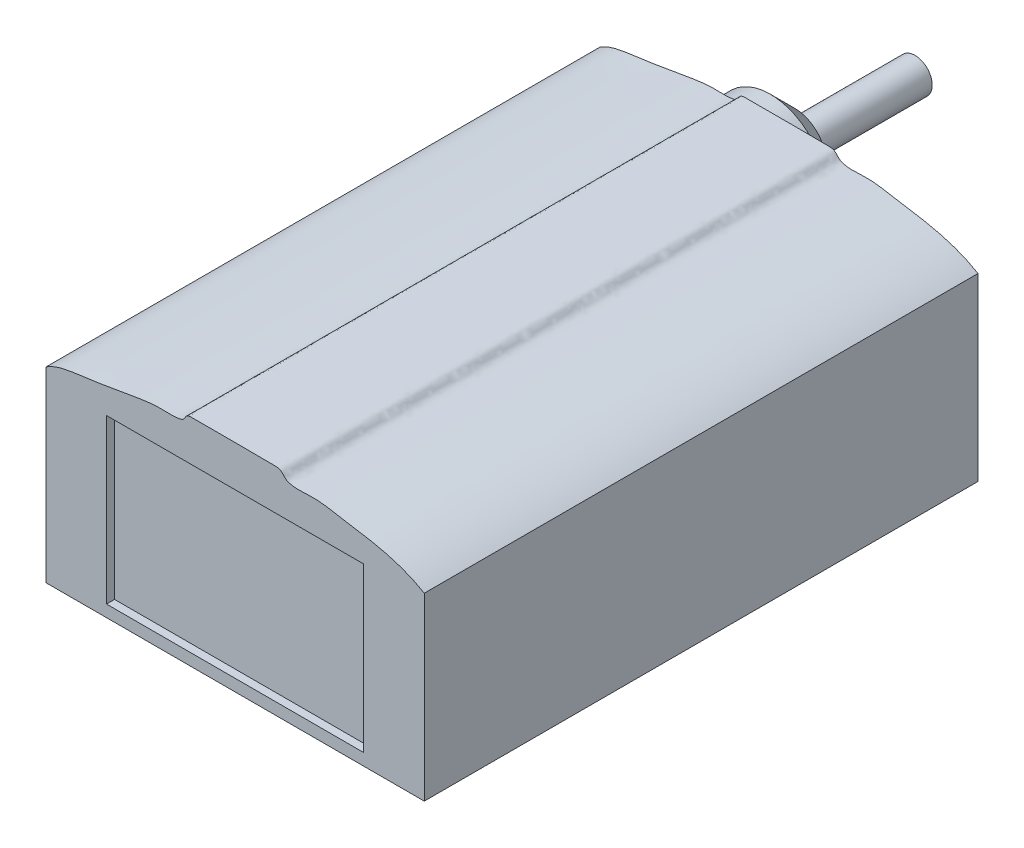
ISO-10303-21;
HEADER;
FILE_DESCRIPTION(('STEP AP214'),'2;1');
FILE_NAME('part.step','',(''),(''),'','','');
FILE_SCHEMA(('AUTOMOTIVE_DESIGN { 1 0 10303 214 1 1 1 1 }'));
ENDSEC;
DATA;
#1=APPLICATION_CONTEXT('core data for automotive mechanical design processes');
#2=APPLICATION_PROTOCOL_DEFINITION('international standard','automotive_design',2000,#1);
#3=PRODUCT_CONTEXT('',#1,'mechanical');
#4=PRODUCT('Part','Part','',(#3));
#5=PRODUCT_RELATED_PRODUCT_CATEGORY('part','',(#4));
#6=PRODUCT_DEFINITION_FORMATION('','',#4);
#7=PRODUCT_DEFINITION_CONTEXT('part definition',#1,'design');
#8=PRODUCT_DEFINITION('design','',#6,#7);
#9=PRODUCT_DEFINITION_SHAPE('','',#8);
#10=(LENGTH_UNIT() NAMED_UNIT(*) SI_UNIT(.MILLI.,.METRE.));
#11=(NAMED_UNIT(*) PLANE_ANGLE_UNIT() SI_UNIT($,.RADIAN.));
#12=(NAMED_UNIT(*) SI_UNIT($,.STERADIAN.) SOLID_ANGLE_UNIT());
#13=UNCERTAINTY_MEASURE_WITH_UNIT(LENGTH_MEASURE(1.E-05),#10,'distance_accuracy_value','');
#14=(GEOMETRIC_REPRESENTATION_CONTEXT(3) GLOBAL_UNCERTAINTY_ASSIGNED_CONTEXT((#13)) GLOBAL_UNIT_ASSIGNED_CONTEXT((#10,
#11,#12)) REPRESENTATION_CONTEXT('',''));
#15=CARTESIAN_POINT('',(0.,0.,0.));
#16=DIRECTION('',(0.,0.,1.));
#17=DIRECTION('',(1.,0.,0.));
#18=AXIS2_PLACEMENT_3D('',#15,#16,#17);
#19=CARTESIAN_POINT('',(-140.98194211339,-84.1096780381696,68.9));
#20=DIRECTION('',(-1.,0.,0.));
#21=DIRECTION('',(0.,0.,1.));
#22=AXIS2_PLACEMENT_3D('',#19,#20,#21);
#23=PLANE('',#22);
#24=DIRECTION('',(0.,1.,0.));
#25=VECTOR('',#24,1.);
#26=CARTESIAN_POINT('',(-140.98194211339,-84.1096780381696,0.));
#27=LINE('',#26,#25);
#28=CARTESIAN_POINT('',(-140.98194211339,-106.521233953106,0.));
#29=VERTEX_POINT('',#28);
#30=CARTESIAN_POINT('',(-140.98194211339,-84.1096780381696,0.));
#31=VERTEX_POINT('',#30);
#32=EDGE_CURVE('E148',#29,#31,#27,.T.);
#33=ORIENTED_EDGE('',*,*,#32,.T.);
#34=DIRECTION('',(0.,0.,-1.));
#35=VECTOR('',#34,1.);
#36=CARTESIAN_POINT('',(-140.98194211339,-84.1096780381696,68.9));
#37=LINE('',#36,#35);
#38=CARTESIAN_POINT('',(-140.98194211339,-84.1096780381696,68.9));
#39=VERTEX_POINT('',#38);
#40=EDGE_CURVE('E175',#39,#31,#37,.T.);
#41=ORIENTED_EDGE('',*,*,#40,.F.);
#42=DIRECTION('',(0.,1.,0.));
#43=VECTOR('',#42,1.);
#44=CARTESIAN_POINT('',(-140.98194211339,-84.1096780381696,68.9));
#45=LINE('',#44,#43);
#46=CARTESIAN_POINT('',(-140.98194211339,-106.521233953106,68.9));
#47=VERTEX_POINT('',#46);
#48=EDGE_CURVE('E150',#47,#39,#45,.T.);
#49=ORIENTED_EDGE('',*,*,#48,.F.);
#50=DIRECTION('',(0.,0.,-1.));
#51=VECTOR('',#50,1.);
#52=CARTESIAN_POINT('',(-140.98194211339,-106.521233953106,68.9));
#53=LINE('',#52,#51);
#54=EDGE_CURVE('E176',#47,#29,#53,.T.);
#55=ORIENTED_EDGE('',*,*,#54,.T.);
#56=EDGE_LOOP('',(#33,#41,#49,#55));
#57=FACE_BOUND('',#56,.T.);
#58=ADVANCED_FACE('F32',(#57),#23,.F.);
#59=CARTESIAN_POINT('',(-140.98194211339,-84.1096780381696,68.9));
#60=CARTESIAN_POINT('',(-142.926815311891,-82.9516409905917,68.9));
#61=CARTESIAN_POINT('',(-146.373565536085,-81.8972950871516,68.9));
#62=CARTESIAN_POINT('',(-151.070724865634,-81.2670738500775,68.9));
#63=CARTESIAN_POINT('',(-154.650535556346,-80.5007113797014,68.9));
#64=CARTESIAN_POINT('',(-156.859894773962,-80.9524390764179,68.9));
#65=CARTESIAN_POINT('',(-158.338667639974,-80.4501070385358,68.9));
#66=CARTESIAN_POINT('',(-158.75592069697,-79.6610562019092,68.9));
#67=CARTESIAN_POINT('',(-161.911227506149,-79.6747307356788,68.9));
#68=CARTESIAN_POINT('',(-168.676391513711,-79.5974541144209,68.9));
#69=CARTESIAN_POINT('',(-170.710950221123,-79.6679789403554,68.9));
#70=CARTESIAN_POINT('',(-170.781028922424,-80.4021499559249,68.9));
#71=CARTESIAN_POINT('',(-172.311248734605,-80.7264156411539,68.9));
#72=CARTESIAN_POINT('',(-174.129855051625,-80.4879074300966,68.9));
#73=CARTESIAN_POINT('',(-177.11443979036,-80.9668373289222,68.9));
#74=CARTESIAN_POINT('',(-180.269750477612,-81.5393009612148,68.9));
#75=CARTESIAN_POINT('',(-184.014745848683,-82.0981839605226,68.9));
#76=CARTESIAN_POINT('',(-186.751441624602,-82.4001034778678,68.9));
#77=CARTESIAN_POINT('',(-188.05194211339,-83.2641710067041,68.9));
#78=B_SPLINE_CURVE_WITH_KNOTS('',3,(#59,#60,#61,#62,#63,#64,#65,#66,#67,#68,#69,#70,#71,#72,#73,
#74,#75,#76,#77),.UNSPECIFIED.,.F.,.F.,(4,1,1,1,1,1,1,1,1,1,1,1,1,1,1,1,4),(0.,
0.125193101078985,0.195471816087271,0.265347399385533,0.320434923868102,0.328753754329254,
0.346337709589521,0.360830221550765,0.459186361980452,0.475147960494931,0.504484608181078,
0.516555423799239,0.592189035715779,0.674550960962052,0.768343750931255,0.869311161488554,1.),.UNSPECIFIED.);
#79=DIRECTION('',(0.,0.,-1.));
#80=VECTOR('',#79,1.);
#81=SURFACE_OF_LINEAR_EXTRUSION('',#78,#80);
#82=CARTESIAN_POINT('',(-140.98194211339,-84.1096780381696,0.));
#83=CARTESIAN_POINT('',(-142.926815311891,-82.9516409905917,0.));
#84=CARTESIAN_POINT('',(-146.373565536085,-81.8972950871516,0.));
#85=CARTESIAN_POINT('',(-151.070724865634,-81.2670738500775,0.));
#86=CARTESIAN_POINT('',(-154.650535556346,-80.5007113797014,0.));
#87=CARTESIAN_POINT('',(-156.859894773962,-80.9524390764179,0.));
#88=CARTESIAN_POINT('',(-158.338667639974,-80.4501070385358,0.));
#89=CARTESIAN_POINT('',(-158.75592069697,-79.6610562019092,0.));
#90=CARTESIAN_POINT('',(-161.911227506149,-79.6747307356788,0.));
#91=CARTESIAN_POINT('',(-168.676391513711,-79.5974541144209,0.));
#92=CARTESIAN_POINT('',(-170.710950221123,-79.6679789403554,0.));
#93=CARTESIAN_POINT('',(-170.781028922424,-80.4021499559249,0.));
#94=CARTESIAN_POINT('',(-172.311248734605,-80.7264156411539,0.));
#95=CARTESIAN_POINT('',(-174.129855051625,-80.4879074300966,0.));
#96=CARTESIAN_POINT('',(-177.11443979036,-80.9668373289222,0.));
#97=CARTESIAN_POINT('',(-180.269750477612,-81.5393009612148,0.));
#98=CARTESIAN_POINT('',(-184.014745848683,-82.0981839605226,0.));
#99=CARTESIAN_POINT('',(-186.751441624602,-82.4001034778678,0.));
#100=CARTESIAN_POINT('',(-188.05194211339,-83.2641710067041,0.));
#101=B_SPLINE_CURVE_WITH_KNOTS('',3,(#82,#83,#84,#85,#86,#87,#88,#89,#90,#91,#92,#93,#94,#95,
#96,#97,#98,#99,#100),.UNSPECIFIED.,.F.,.F.,(4,1,1,1,1,1,1,1,1,1,1,1,1,1,1,1,4),(0.,
0.125193101078985,0.195471816087271,0.265347399385533,0.320434923868102,0.328753754329254,
0.346337709589521,0.360830221550765,0.459186361980452,0.475147960494931,0.504484608181078,
0.516555423799239,0.592189035715779,0.674550960962052,0.768343750931255,0.869311161488554,1.),.UNSPECIFIED.);
#102=CARTESIAN_POINT('',(-188.05194211339,-83.2641710067041,0.));
#103=VERTEX_POINT('',#102);
#104=EDGE_CURVE('E178',#31,#103,#101,.T.);
#105=ORIENTED_EDGE('',*,*,#104,.T.);
#106=DIRECTION('',(0.,0.,-1.));
#107=VECTOR('',#106,1.);
#108=CARTESIAN_POINT('',(-188.05194211339,-83.2641710067041,68.9));
#109=LINE('',#108,#107);
#110=CARTESIAN_POINT('',(-188.05194211339,-83.2641710067041,68.9));
#111=VERTEX_POINT('',#110);
#112=EDGE_CURVE('E193',#111,#103,#109,.T.);
#113=ORIENTED_EDGE('',*,*,#112,.F.);
#114=EDGE_CURVE('E86',#39,#111,#78,.T.);
#115=ORIENTED_EDGE('',*,*,#114,.F.);
#116=ORIENTED_EDGE('',*,*,#40,.T.);
#117=EDGE_LOOP('',(#105,#113,#115,#116));
#118=FACE_BOUND('',#117,.T.);
#119=ADVANCED_FACE('F162',(#118),#81,.F.);
#120=CARTESIAN_POINT('',(-188.05194211339,-83.2641710067041,68.9));
#121=DIRECTION('',(1.,0.,0.));
#122=DIRECTION('',(0.,0.,-1.));
#123=AXIS2_PLACEMENT_3D('',#120,#121,#122);
#124=PLANE('',#123);
#125=DIRECTION('',(0.,-1.,0.));
#126=VECTOR('',#125,1.);
#127=CARTESIAN_POINT('',(-188.05194211339,-83.2641710067041,0.));
#128=LINE('',#127,#126);
#129=CARTESIAN_POINT('',(-188.05194211339,-106.521233953106,0.));
#130=VERTEX_POINT('',#129);
#131=EDGE_CURVE('E180',#103,#130,#128,.T.);
#132=ORIENTED_EDGE('',*,*,#131,.T.);
#133=DIRECTION('',(0.,0.,-1.));
#134=VECTOR('',#133,1.);
#135=CARTESIAN_POINT('',(-188.05194211339,-106.521233953106,68.9));
#136=LINE('',#135,#134);
#137=CARTESIAN_POINT('',(-188.05194211339,-106.521233953106,68.9));
#138=VERTEX_POINT('',#137);
#139=EDGE_CURVE('E191',#138,#130,#136,.T.);
#140=ORIENTED_EDGE('',*,*,#139,.F.);
#141=DIRECTION('',(0.,-1.,0.));
#142=VECTOR('',#141,1.);
#143=CARTESIAN_POINT('',(-188.05194211339,-83.2641710067041,68.9));
#144=LINE('',#143,#142);
#145=EDGE_CURVE('E156',#111,#138,#144,.T.);
#146=ORIENTED_EDGE('',*,*,#145,.F.);
#147=ORIENTED_EDGE('',*,*,#112,.T.);
#148=EDGE_LOOP('',(#132,#140,#146,#147));
#149=FACE_BOUND('',#148,.T.);
#150=ADVANCED_FACE('F165',(#149),#124,.F.);
#151=CARTESIAN_POINT('',(-188.05194211339,-106.521233953106,68.9));
#152=DIRECTION('',(0.,1.,0.));
#153=DIRECTION('',(0.,0.,1.));
#154=AXIS2_PLACEMENT_3D('',#151,#152,#153);
#155=PLANE('',#154);
#156=DIRECTION('',(1.,0.,0.));
#157=VECTOR('',#156,1.);
#158=CARTESIAN_POINT('',(-188.05194211339,-106.521233953106,0.));
#159=LINE('',#158,#157);
#160=EDGE_CURVE('E78',#130,#29,#159,.T.);
#161=ORIENTED_EDGE('',*,*,#160,.T.);
#162=ORIENTED_EDGE('',*,*,#54,.F.);
#163=DIRECTION('',(1.,0.,0.));
#164=VECTOR('',#163,1.);
#165=CARTESIAN_POINT('',(-188.05194211339,-106.521233953106,68.9));
#166=LINE('',#165,#164);
#167=EDGE_CURVE('E57',#138,#47,#166,.T.);
#168=ORIENTED_EDGE('',*,*,#167,.F.);
#169=ORIENTED_EDGE('',*,*,#139,.T.);
#170=EDGE_LOOP('',(#161,#162,#168,#169));
#171=FACE_BOUND('',#170,.T.);
#172=ADVANCED_FACE('F233',(#171),#155,.F.);
#173=CARTESIAN_POINT('',(-170.934573099941,-80.3250737101077,68.9));
#174=DIRECTION('',(0.,0.,1.));
#175=DIRECTION('',(1.,0.,0.));
#176=AXIS2_PLACEMENT_3D('',#173,#174,#175);
#177=PLANE('',#176);
#178=DIRECTION('',(0.,-1.,0.));
#179=VECTOR('',#178,1.);
#180=CARTESIAN_POINT('',(-180.51694211339,-84.7327024799048,68.9));
#181=LINE('',#180,#179);
#182=CARTESIAN_POINT('',(-180.51694211339,-84.7327024799048,68.9));
#183=VERTEX_POINT('',#182);
#184=CARTESIAN_POINT('',(-180.51694211339,-105.052702479905,68.9));
#185=VERTEX_POINT('',#184);
#186=EDGE_CURVE('E48',#183,#185,#181,.T.);
#187=ORIENTED_EDGE('',*,*,#186,.F.);
#188=DIRECTION('',(-1.,0.,0.));
#189=VECTOR('',#188,1.);
#190=CARTESIAN_POINT('',(-180.51694211339,-84.7327024799048,68.9));
#191=LINE('',#190,#189);
#192=CARTESIAN_POINT('',(-148.51694211339,-84.7327024799048,68.9));
#193=VERTEX_POINT('',#192);
#194=EDGE_CURVE('E128',#193,#183,#191,.T.);
#195=ORIENTED_EDGE('',*,*,#194,.F.);
#196=DIRECTION('',(0.,1.,0.));
#197=VECTOR('',#196,1.);
#198=CARTESIAN_POINT('',(-148.51694211339,-84.7327024799048,68.9));
#199=LINE('',#198,#197);
#200=CARTESIAN_POINT('',(-148.51694211339,-105.052702479905,68.9));
#201=VERTEX_POINT('',#200);
#202=EDGE_CURVE('E131',#201,#193,#199,.T.);
#203=ORIENTED_EDGE('',*,*,#202,.F.);
#204=DIRECTION('',(1.,0.,0.));
#205=VECTOR('',#204,1.);
#206=CARTESIAN_POINT('',(-180.51694211339,-105.052702479905,68.9));
#207=LINE('',#206,#205);
#208=EDGE_CURVE('E137',#185,#201,#207,.T.);
#209=ORIENTED_EDGE('',*,*,#208,.F.);
#210=EDGE_LOOP('',(#187,#195,#203,#209));
#211=FACE_BOUND('',#210,.T.);
#212=ORIENTED_EDGE('',*,*,#48,.T.);
#213=ORIENTED_EDGE('',*,*,#114,.T.);
#214=ORIENTED_EDGE('',*,*,#145,.T.);
#215=ORIENTED_EDGE('',*,*,#167,.T.);
#216=EDGE_LOOP('',(#212,#213,#214,#215));
#217=FACE_BOUND('',#216,.T.);
#218=ADVANCED_FACE('F230',(#211,#217),#177,.T.);
#219=CARTESIAN_POINT('',(-170.934573099941,-80.3250737101077,0.));
#220=DIRECTION('',(0.,0.,1.));
#221=DIRECTION('',(1.,0.,0.));
#222=AXIS2_PLACEMENT_3D('',#219,#220,#221);
#223=PLANE('',#222);
#224=CARTESIAN_POINT('',(-176.611079588738,-94.4581231565486,0.));
#225=DIRECTION('',(0.,0.,1.));
#226=DIRECTION('',(1.,0.,0.));
#227=AXIS2_PLACEMENT_3D('',#224,#225,#226);
#228=CIRCLE('',#227,6.95000000000002);
#229=CARTESIAN_POINT('',(-169.661079588738,-94.4581231565486,0.));
#230=VERTEX_POINT('',#229);
#231=EDGE_CURVE('E197',#230,#230,#228,.F.);
#232=ORIENTED_EDGE('',*,*,#231,.F.);
#233=EDGE_LOOP('',(#232));
#234=FACE_BOUND('',#233,.T.);
#235=ORIENTED_EDGE('',*,*,#32,.F.);
#236=ORIENTED_EDGE('',*,*,#160,.F.);
#237=ORIENTED_EDGE('',*,*,#131,.F.);
#238=ORIENTED_EDGE('',*,*,#104,.F.);
#239=EDGE_LOOP('',(#235,#236,#237,#238));
#240=FACE_BOUND('',#239,.T.);
#241=ADVANCED_FACE('F225',(#234,#240),#223,.F.);
#242=CARTESIAN_POINT('',(-176.611079588738,-94.4581231565486,-12.8));
#243=DIRECTION('',(0.,0.,1.));
#244=DIRECTION('',(1.,0.,0.));
#245=AXIS2_PLACEMENT_3D('',#242,#243,#244);
#246=CYLINDRICAL_SURFACE('',#245,6.95000000000002);
#247=CARTESIAN_POINT('',(-176.611079588738,-94.4581231565486,-9.79999999999998));
#248=DIRECTION('',(0.,0.,-1.));
#249=DIRECTION('',(-1.,0.,0.));
#250=AXIS2_PLACEMENT_3D('',#247,#248,#249);
#251=CIRCLE('',#250,6.95000000000002);
#252=CARTESIAN_POINT('',(-169.661079588738,-94.4581231565486,-9.79999999999998));
#253=VERTEX_POINT('',#252);
#254=EDGE_CURVE('E36',#253,#253,#251,.F.);
#255=ORIENTED_EDGE('',*,*,#254,.T.);
#256=EDGE_LOOP('',(#255));
#257=FACE_BOUND('',#256,.T.);
#258=ORIENTED_EDGE('',*,*,#231,.T.);
#259=EDGE_LOOP('',(#258));
#260=FACE_BOUND('',#259,.T.);
#261=ADVANCED_FACE('F206',(#257,#260),#246,.T.);
#262=CARTESIAN_POINT('',(-176.611079588738,-94.4581231565486,-12.8));
#263=DIRECTION('',(0.,0.,-1.));
#264=DIRECTION('',(-1.,0.,0.));
#265=AXIS2_PLACEMENT_3D('',#262,#263,#264);
#266=PLANE('',#265);
#267=CARTESIAN_POINT('',(-176.611079588738,-94.4581231565486,-12.8));
#268=DIRECTION('',(0.,0.,-1.));
#269=DIRECTION('',(-1.,0.,0.));
#270=AXIS2_PLACEMENT_3D('',#267,#268,#269);
#271=CIRCLE('',#270,2.13578382501515);
#272=CARTESIAN_POINT('',(-178.746863413753,-94.4581231565486,-12.8));
#273=VERTEX_POINT('',#272);
#274=EDGE_CURVE('E11',#273,#273,#271,.T.);
#275=ORIENTED_EDGE('',*,*,#274,.F.);
#276=EDGE_LOOP('',(#275));
#277=FACE_BOUND('',#276,.T.);
#278=CARTESIAN_POINT('',(-176.611079588738,-94.4581231565486,-12.8));
#279=DIRECTION('',(0.,0.,-1.));
#280=DIRECTION('',(-1.,0.,0.));
#281=AXIS2_PLACEMENT_3D('',#278,#279,#280);
#282=CIRCLE('',#281,3.95000000000001);
#283=CARTESIAN_POINT('',(-172.661079588738,-94.4581231565486,-12.8));
#284=VERTEX_POINT('',#283);
#285=EDGE_CURVE('E199',#284,#284,#282,.T.);
#286=ORIENTED_EDGE('',*,*,#285,.T.);
#287=EDGE_LOOP('',(#286));
#288=FACE_BOUND('',#287,.T.);
#289=ADVANCED_FACE('F212',(#277,#288),#266,.T.);
#290=CARTESIAN_POINT('',(-176.611079588738,-94.4581231565486,-12.8));
#291=DIRECTION('',(0.,0.,1.));
#292=DIRECTION('',(1.,0.,0.));
#293=AXIS2_PLACEMENT_3D('',#290,#291,#292);
#294=CONICAL_SURFACE('',#293,3.95000000000001,0.785398163397445);
#295=CARTESIAN_POINT('',(-169.661079588738,-94.4581231565486,-9.79999999999998));
#296=CARTESIAN_POINT('',(-169.692329588738,-94.4581231565486,-9.83124999999998));
#297=CARTESIAN_POINT('',(-169.723579588738,-94.4581231565486,-9.86249999999998));
#298=CARTESIAN_POINT('',(-169.786079588738,-94.4581231565486,-9.92499999999998));
#299=CARTESIAN_POINT('',(-169.817329588738,-94.4581231565486,-9.95624999999998));
#300=CARTESIAN_POINT('',(-169.879829588738,-94.4581231565486,-10.01875));
#301=CARTESIAN_POINT('',(-169.911079588738,-94.4581231565486,-10.05));
#302=CARTESIAN_POINT('',(-169.973579588738,-94.4581231565486,-10.1125));
#303=CARTESIAN_POINT('',(-170.004829588738,-94.4581231565486,-10.14375));
#304=CARTESIAN_POINT('',(-170.067329588738,-94.4581231565486,-10.20625));
#305=CARTESIAN_POINT('',(-170.098579588738,-94.4581231565486,-10.2375));
#306=CARTESIAN_POINT('',(-170.161079588738,-94.4581231565486,-10.3));
#307=CARTESIAN_POINT('',(-170.192329588738,-94.4581231565486,-10.33125));
#308=CARTESIAN_POINT('',(-170.254829588738,-94.4581231565486,-10.39375));
#309=CARTESIAN_POINT('',(-170.286079588738,-94.4581231565486,-10.425));
#310=CARTESIAN_POINT('',(-170.348579588738,-94.4581231565486,-10.4875));
#311=CARTESIAN_POINT('',(-170.379829588738,-94.4581231565486,-10.51875));
#312=CARTESIAN_POINT('',(-170.442329588738,-94.4581231565486,-10.58125));
#313=CARTESIAN_POINT('',(-170.473579588738,-94.4581231565486,-10.6125));
#314=CARTESIAN_POINT('',(-170.536079588738,-94.4581231565486,-10.675));
#315=CARTESIAN_POINT('',(-170.567329588738,-94.4581231565486,-10.70625));
#316=CARTESIAN_POINT('',(-170.629829588738,-94.4581231565486,-10.76875));
#317=CARTESIAN_POINT('',(-170.661079588738,-94.4581231565486,-10.8));
#318=CARTESIAN_POINT('',(-170.723579588738,-94.4581231565486,-10.8625));
#319=CARTESIAN_POINT('',(-170.754829588738,-94.4581231565486,-10.89375));
#320=CARTESIAN_POINT('',(-170.817329588738,-94.4581231565486,-10.95625));
#321=CARTESIAN_POINT('',(-170.848579588738,-94.4581231565486,-10.9875));
#322=CARTESIAN_POINT('',(-170.911079588738,-94.4581231565486,-11.05));
#323=CARTESIAN_POINT('',(-170.942329588738,-94.4581231565486,-11.08125));
#324=CARTESIAN_POINT('',(-171.004829588738,-94.4581231565486,-11.14375));
#325=CARTESIAN_POINT('',(-171.036079588738,-94.4581231565486,-11.175));
#326=CARTESIAN_POINT('',(-171.098579588738,-94.4581231565486,-11.2375));
#327=CARTESIAN_POINT('',(-171.129829588738,-94.4581231565486,-11.26875));
#328=CARTESIAN_POINT('',(-171.192329588738,-94.4581231565486,-11.33125));
#329=CARTESIAN_POINT('',(-171.223579588738,-94.4581231565486,-11.3625));
#330=CARTESIAN_POINT('',(-171.286079588738,-94.4581231565486,-11.425));
#331=CARTESIAN_POINT('',(-171.317329588738,-94.4581231565486,-11.45625));
#332=CARTESIAN_POINT('',(-171.379829588738,-94.4581231565486,-11.51875));
#333=CARTESIAN_POINT('',(-171.411079588738,-94.4581231565486,-11.55));
#334=CARTESIAN_POINT('',(-171.473579588738,-94.4581231565486,-11.6125));
#335=CARTESIAN_POINT('',(-171.504829588738,-94.4581231565486,-11.64375));
#336=CARTESIAN_POINT('',(-171.567329588738,-94.4581231565486,-11.70625));
#337=CARTESIAN_POINT('',(-171.598579588738,-94.4581231565486,-11.7375));
#338=CARTESIAN_POINT('',(-171.661079588738,-94.4581231565486,-11.8));
#339=CARTESIAN_POINT('',(-171.692329588738,-94.4581231565486,-11.83125));
#340=CARTESIAN_POINT('',(-171.754829588738,-94.4581231565486,-11.89375));
#341=CARTESIAN_POINT('',(-171.786079588738,-94.4581231565486,-11.925));
#342=CARTESIAN_POINT('',(-171.848579588738,-94.4581231565486,-11.9875));
#343=CARTESIAN_POINT('',(-171.879829588738,-94.4581231565486,-12.01875));
#344=CARTESIAN_POINT('',(-171.942329588738,-94.4581231565486,-12.08125));
#345=CARTESIAN_POINT('',(-171.973579588738,-94.4581231565486,-12.1125));
#346=CARTESIAN_POINT('',(-172.036079588738,-94.4581231565486,-12.175));
#347=CARTESIAN_POINT('',(-172.067329588738,-94.4581231565486,-12.20625));
#348=CARTESIAN_POINT('',(-172.129829588738,-94.4581231565486,-12.26875));
#349=CARTESIAN_POINT('',(-172.161079588738,-94.4581231565486,-12.3));
#350=CARTESIAN_POINT('',(-172.223579588738,-94.4581231565486,-12.3625));
#351=CARTESIAN_POINT('',(-172.254829588738,-94.4581231565486,-12.39375));
#352=CARTESIAN_POINT('',(-172.317329588738,-94.4581231565486,-12.45625));
#353=CARTESIAN_POINT('',(-172.348579588738,-94.4581231565486,-12.4875));
#354=CARTESIAN_POINT('',(-172.411079588738,-94.4581231565486,-12.55));
#355=CARTESIAN_POINT('',(-172.442329588738,-94.4581231565486,-12.58125));
#356=CARTESIAN_POINT('',(-172.504829588738,-94.4581231565486,-12.64375));
#357=CARTESIAN_POINT('',(-172.536079588738,-94.4581231565486,-12.675));
#358=CARTESIAN_POINT('',(-172.598579588738,-94.4581231565486,-12.7375));
#359=CARTESIAN_POINT('',(-172.629829588738,-94.4581231565486,-12.76875));
#360=CARTESIAN_POINT('',(-172.661079588738,-94.4581231565486,-12.8));
#361=B_SPLINE_CURVE_WITH_KNOTS('',3,(#295,#296,#297,#298,#299,#300,#301,#302,#303,#304,#305,
#306,#307,#308,#309,#310,#311,#312,#313,#314,#315,#316,#317,#318,#319,#320,#321,#322,#323,#324,
#325,#326,#327,#328,#329,#330,#331,#332,#333,#334,#335,#336,#337,#338,#339,#340,#341,#342,#343,
#344,#345,#346,#347,#348,#349,#350,#351,#352,#353,#354,#355,#356,#357,#358,#359,#360),
.UNSPECIFIED.,.F.,.F.,(4,2,2,2,2,2,2,2,2,2,2,2,2,2,2,2,2,2,2,2,2,2,2,2,2,2,2,2,2,2,2,2,4),(0.,
0.13258252147248,0.265165042944962,0.397747564417422,0.530330085889902,0.662912607362384,
0.795495128834864,0.928077650307344,1.06066017177983,1.19324269325231,1.32582521472479,
1.45840773619725,1.59099025766973,1.72357277914221,1.85615530061469,1.98873782208717,
2.12132034355965,2.25390286503213,2.38648538650461,2.51906790797709,2.65165042944955,
2.78423295092204,2.91681547239452,3.049397993867,3.18198051533948,3.31456303681196,
3.44714555828444,3.57972807975692,3.71231060122938,3.84489312270186,3.97747564417434,
4.11005816564682,4.2426406871193),.UNSPECIFIED.);
#362=EDGE_CURVE('BSEAM34',#253,#284,#361,.T.);
#363=ORIENTED_EDGE('',*,*,#254,.F.);
#364=ORIENTED_EDGE('',*,*,#285,.F.);
#365=ORIENTED_EDGE('',*,*,#362,.T.);
#366=ORIENTED_EDGE('',*,*,#362,.F.);
#367=EDGE_LOOP('',(#363,#365,#364,#366));
#368=FACE_BOUND('',#367,.T.);
#369=ADVANCED_FACE('F34',(#368),#294,.T.);
#370=CARTESIAN_POINT('',(-176.611079588738,-94.4581231565486,-27.8));
#371=DIRECTION('',(0.,0.,1.));
#372=DIRECTION('',(1.,0.,0.));
#373=AXIS2_PLACEMENT_3D('',#370,#371,#372);
#374=CYLINDRICAL_SURFACE('',#373,2.13578382501515);
#375=CARTESIAN_POINT('',(-176.611079588738,-94.4581231565486,-27.8));
#376=DIRECTION('',(0.,0.,-1.));
#377=DIRECTION('',(-1.,0.,0.));
#378=AXIS2_PLACEMENT_3D('',#375,#376,#377);
#379=CIRCLE('',#378,2.13578382501515);
#380=CARTESIAN_POINT('',(-178.746863413753,-94.4581231565486,-27.8));
#381=VERTEX_POINT('',#380);
#382=EDGE_CURVE('E143',#381,#381,#379,.T.);
#383=ORIENTED_EDGE('',*,*,#382,.F.);
#384=EDGE_LOOP('',(#383));
#385=FACE_BOUND('',#384,.T.);
#386=ORIENTED_EDGE('',*,*,#274,.T.);
#387=EDGE_LOOP('',(#386));
#388=FACE_BOUND('',#387,.T.);
#389=ADVANCED_FACE('F211',(#385,#388),#374,.T.);
#390=CARTESIAN_POINT('',(-176.611079588738,-94.4581231565486,-27.8));
#391=DIRECTION('',(0.,0.,-1.));
#392=DIRECTION('',(-1.,0.,0.));
#393=AXIS2_PLACEMENT_3D('',#390,#391,#392);
#394=PLANE('',#393);
#395=ORIENTED_EDGE('',*,*,#382,.T.);
#396=EDGE_LOOP('',(#395));
#397=FACE_BOUND('',#396,.T.);
#398=ADVANCED_FACE('F217',(#397),#394,.T.);
#399=CARTESIAN_POINT('',(-180.51694211339,-84.7327024799048,67.9));
#400=DIRECTION('',(-1.,0.,0.));
#401=DIRECTION('',(0.,0.,1.));
#402=AXIS2_PLACEMENT_3D('',#399,#400,#401);
#403=PLANE('',#402);
#404=ORIENTED_EDGE('',*,*,#186,.T.);
#405=DIRECTION('',(0.,0.,1.));
#406=VECTOR('',#405,1.);
#407=CARTESIAN_POINT('',(-180.51694211339,-105.052702479905,67.9));
#408=LINE('',#407,#406);
#409=CARTESIAN_POINT('',(-180.51694211339,-105.052702479905,67.9));
#410=VERTEX_POINT('',#409);
#411=EDGE_CURVE('E106',#410,#185,#408,.T.);
#412=ORIENTED_EDGE('',*,*,#411,.F.);
#413=DIRECTION('',(0.,-1.,0.));
#414=VECTOR('',#413,1.);
#415=CARTESIAN_POINT('',(-180.51694211339,-84.7327024799048,67.9));
#416=LINE('',#415,#414);
#417=CARTESIAN_POINT('',(-180.51694211339,-84.7327024799048,67.9));
#418=VERTEX_POINT('',#417);
#419=EDGE_CURVE('E110',#418,#410,#416,.T.);
#420=ORIENTED_EDGE('',*,*,#419,.F.);
#421=DIRECTION('',(0.,0.,1.));
#422=VECTOR('',#421,1.);
#423=CARTESIAN_POINT('',(-180.51694211339,-84.7327024799048,67.9));
#424=LINE('',#423,#422);
#425=EDGE_CURVE('E141',#418,#183,#424,.T.);
#426=ORIENTED_EDGE('',*,*,#425,.T.);
#427=EDGE_LOOP('',(#404,#412,#420,#426));
#428=FACE_BOUND('',#427,.T.);
#429=ADVANCED_FACE('F108',(#428),#403,.F.);
#430=CARTESIAN_POINT('',(-180.51694211339,-84.7327024799048,67.9));
#431=DIRECTION('',(0.,1.,0.));
#432=DIRECTION('',(0.,0.,1.));
#433=AXIS2_PLACEMENT_3D('',#430,#431,#432);
#434=PLANE('',#433);
#435=ORIENTED_EDGE('',*,*,#194,.T.);
#436=ORIENTED_EDGE('',*,*,#425,.F.);
#437=DIRECTION('',(-1.,0.,0.));
#438=VECTOR('',#437,1.);
#439=CARTESIAN_POINT('',(-180.51694211339,-84.7327024799048,67.9));
#440=LINE('',#439,#438);
#441=CARTESIAN_POINT('',(-148.51694211339,-84.7327024799048,67.9));
#442=VERTEX_POINT('',#441);
#443=EDGE_CURVE('E116',#442,#418,#440,.T.);
#444=ORIENTED_EDGE('',*,*,#443,.F.);
#445=DIRECTION('',(0.,0.,1.));
#446=VECTOR('',#445,1.);
#447=CARTESIAN_POINT('',(-148.51694211339,-84.7327024799048,67.9));
#448=LINE('',#447,#446);
#449=EDGE_CURVE('E144',#442,#193,#448,.T.);
#450=ORIENTED_EDGE('',*,*,#449,.T.);
#451=EDGE_LOOP('',(#435,#436,#444,#450));
#452=FACE_BOUND('',#451,.T.);
#453=ADVANCED_FACE('F306',(#452),#434,.F.);
#454=CARTESIAN_POINT('',(-148.51694211339,-84.7327024799048,67.9));
#455=DIRECTION('',(1.,0.,0.));
#456=DIRECTION('',(0.,0.,-1.));
#457=AXIS2_PLACEMENT_3D('',#454,#455,#456);
#458=PLANE('',#457);
#459=ORIENTED_EDGE('',*,*,#202,.T.);
#460=ORIENTED_EDGE('',*,*,#449,.F.);
#461=DIRECTION('',(0.,1.,0.));
#462=VECTOR('',#461,1.);
#463=CARTESIAN_POINT('',(-148.51694211339,-84.7327024799048,67.9));
#464=LINE('',#463,#462);
#465=CARTESIAN_POINT('',(-148.51694211339,-105.052702479905,67.9));
#466=VERTEX_POINT('',#465);
#467=EDGE_CURVE('E124',#466,#442,#464,.T.);
#468=ORIENTED_EDGE('',*,*,#467,.F.);
#469=DIRECTION('',(0.,0.,1.));
#470=VECTOR('',#469,1.);
#471=CARTESIAN_POINT('',(-148.51694211339,-105.052702479905,67.9));
#472=LINE('',#471,#470);
#473=EDGE_CURVE('E115',#466,#201,#472,.T.);
#474=ORIENTED_EDGE('',*,*,#473,.T.);
#475=EDGE_LOOP('',(#459,#460,#468,#474));
#476=FACE_BOUND('',#475,.T.);
#477=ADVANCED_FACE('F314',(#476),#458,.F.);
#478=CARTESIAN_POINT('',(-180.51694211339,-105.052702479905,67.9));
#479=DIRECTION('',(0.,-1.,0.));
#480=DIRECTION('',(0.,0.,-1.));
#481=AXIS2_PLACEMENT_3D('',#478,#479,#480);
#482=PLANE('',#481);
#483=ORIENTED_EDGE('',*,*,#208,.T.);
#484=ORIENTED_EDGE('',*,*,#473,.F.);
#485=DIRECTION('',(1.,0.,0.));
#486=VECTOR('',#485,1.);
#487=CARTESIAN_POINT('',(-180.51694211339,-105.052702479905,67.9));
#488=LINE('',#487,#486);
#489=EDGE_CURVE('E119',#410,#466,#488,.T.);
#490=ORIENTED_EDGE('',*,*,#489,.F.);
#491=ORIENTED_EDGE('',*,*,#411,.T.);
#492=EDGE_LOOP('',(#483,#484,#490,#491));
#493=FACE_BOUND('',#492,.T.);
#494=ADVANCED_FACE('F120',(#493),#482,.F.);
#495=CARTESIAN_POINT('',(0.,0.,67.9));
#496=DIRECTION('',(0.,0.,1.));
#497=DIRECTION('',(1.,0.,0.));
#498=AXIS2_PLACEMENT_3D('',#495,#496,#497);
#499=PLANE('',#498);
#500=ORIENTED_EDGE('',*,*,#419,.T.);
#501=ORIENTED_EDGE('',*,*,#489,.T.);
#502=ORIENTED_EDGE('',*,*,#467,.T.);
#503=ORIENTED_EDGE('',*,*,#443,.T.);
#504=EDGE_LOOP('',(#500,#501,#502,#503));
#505=FACE_BOUND('',#504,.T.);
#506=ADVANCED_FACE('F126',(#505),#499,.T.);
#507=CLOSED_SHELL('',(#58,#119,#150,#172,#218,#241,#261,#289,#369,#389,#398,#429,#453,#477,#494,#506));
#508=MANIFOLD_SOLID_BREP('B2',#507);
#509=ADVANCED_BREP_SHAPE_REPRESENTATION('',(#18,#508),#14);
#510=SHAPE_DEFINITION_REPRESENTATION(#9,#509);
ENDSEC;
END-ISO-10303-21;
